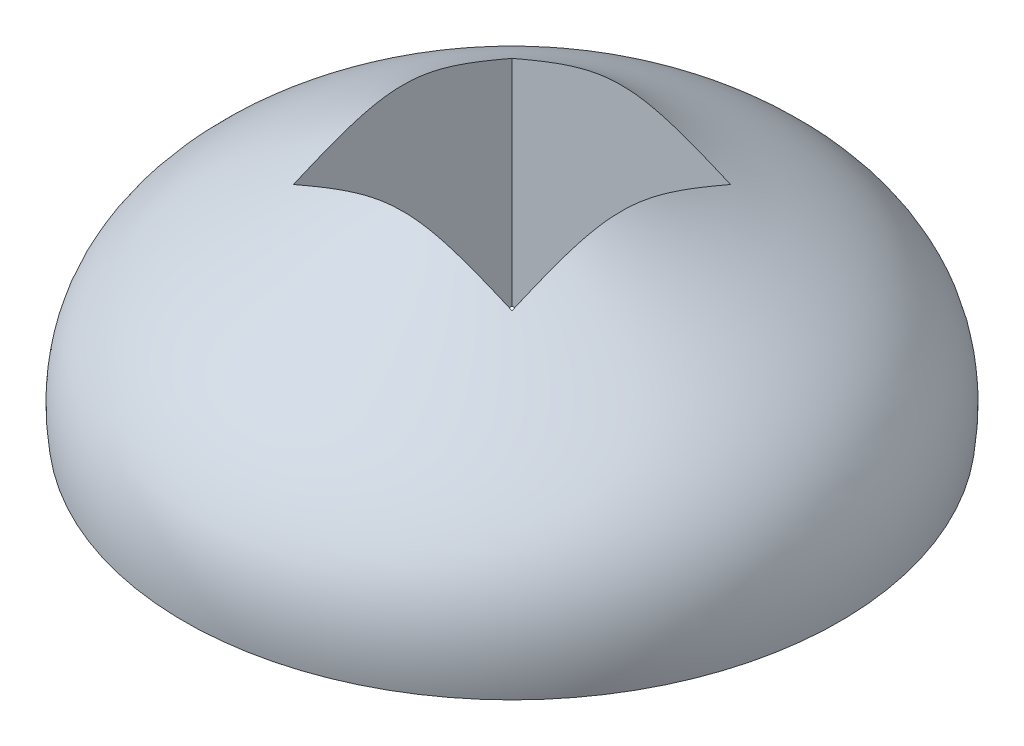
ISO-10303-21;
HEADER;
FILE_DESCRIPTION(('STEP AP214'),'2;1');
FILE_NAME('part.step','',(''),(''),'','','');
FILE_SCHEMA(('AUTOMOTIVE_DESIGN { 1 0 10303 214 1 1 1 1 }'));
ENDSEC;
DATA;
#1=APPLICATION_CONTEXT('core data for automotive mechanical design processes');
#2=APPLICATION_PROTOCOL_DEFINITION('international standard','automotive_design',2000,#1);
#3=PRODUCT_CONTEXT('',#1,'mechanical');
#4=PRODUCT('Part','Part','',(#3));
#5=PRODUCT_RELATED_PRODUCT_CATEGORY('part','',(#4));
#6=PRODUCT_DEFINITION_FORMATION('','',#4);
#7=PRODUCT_DEFINITION_CONTEXT('part definition',#1,'design');
#8=PRODUCT_DEFINITION('design','',#6,#7);
#9=PRODUCT_DEFINITION_SHAPE('','',#8);
#10=(LENGTH_UNIT() NAMED_UNIT(*) SI_UNIT(.MILLI.,.METRE.));
#11=(NAMED_UNIT(*) PLANE_ANGLE_UNIT() SI_UNIT($,.RADIAN.));
#12=(NAMED_UNIT(*) SI_UNIT($,.STERADIAN.) SOLID_ANGLE_UNIT());
#13=UNCERTAINTY_MEASURE_WITH_UNIT(LENGTH_MEASURE(1.E-05),#10,'distance_accuracy_value','');
#14=(GEOMETRIC_REPRESENTATION_CONTEXT(3) GLOBAL_UNCERTAINTY_ASSIGNED_CONTEXT((#13)) GLOBAL_UNIT_ASSIGNED_CONTEXT((#10,
#11,#12)) REPRESENTATION_CONTEXT('',''));
#15=CARTESIAN_POINT('',(0.,0.,0.));
#16=DIRECTION('',(0.,0.,1.));
#17=DIRECTION('',(1.,0.,0.));
#18=AXIS2_PLACEMENT_3D('',#15,#16,#17);
#19=CARTESIAN_POINT('',(0.,0.,0.));
#20=DIRECTION('',(0.,-1.,0.));
#21=DIRECTION('',(0.,0.,-1.));
#22=AXIS2_PLACEMENT_3D('',#19,#20,#21);
#23=PLANE('',#22);
#24=DIRECTION('',(0.,0.,1.));
#25=VECTOR('',#24,1.);
#26=CARTESIAN_POINT('',(0.2,0.,-0.2));
#27=LINE('',#26,#25);
#28=CARTESIAN_POINT('',(0.2,0.,-0.2));
#29=VERTEX_POINT('',#28);
#30=CARTESIAN_POINT('',(0.2,0.,0.2));
#31=VERTEX_POINT('',#30);
#32=EDGE_CURVE('E52',#29,#31,#27,.T.);
#33=ORIENTED_EDGE('',*,*,#32,.F.);
#34=DIRECTION('',(1.,0.,0.));
#35=VECTOR('',#34,1.);
#36=CARTESIAN_POINT('',(-0.2,0.,-0.2));
#37=LINE('',#36,#35);
#38=CARTESIAN_POINT('',(-0.2,0.,-0.2));
#39=VERTEX_POINT('',#38);
#40=EDGE_CURVE('E95',#39,#29,#37,.T.);
#41=ORIENTED_EDGE('',*,*,#40,.F.);
#42=DIRECTION('',(0.,0.,-1.));
#43=VECTOR('',#42,1.);
#44=CARTESIAN_POINT('',(-0.2,0.,-0.2));
#45=LINE('',#44,#43);
#46=CARTESIAN_POINT('',(-0.2,0.,0.2));
#47=VERTEX_POINT('',#46);
#48=EDGE_CURVE('E80',#47,#39,#45,.T.);
#49=ORIENTED_EDGE('',*,*,#48,.F.);
#50=DIRECTION('',(-1.,0.,0.));
#51=VECTOR('',#50,1.);
#52=CARTESIAN_POINT('',(-0.2,0.,0.2));
#53=LINE('',#52,#51);
#54=EDGE_CURVE('E89',#31,#47,#53,.T.);
#55=ORIENTED_EDGE('',*,*,#54,.F.);
#56=EDGE_LOOP('',(#33,#41,#49,#55));
#57=FACE_BOUND('',#56,.T.);
#58=CARTESIAN_POINT('',(0.,0.,0.));
#59=DIRECTION('',(0.,-1.,0.));
#60=DIRECTION('',(0.,0.,-1.));
#61=AXIS2_PLACEMENT_3D('',#58,#59,#60);
#62=CIRCLE('',#61,0.6);
#63=CARTESIAN_POINT('',(0.,0.,-0.6));
#64=VERTEX_POINT('',#63);
#65=EDGE_CURVE('E102',#64,#64,#62,.T.);
#66=ORIENTED_EDGE('',*,*,#65,.T.);
#67=EDGE_LOOP('',(#66));
#68=FACE_BOUND('',#67,.T.);
#69=ADVANCED_FACE('F33',(#57,#68),#23,.T.);
#70=CARTESIAN_POINT('',(0.6,0.,0.));
#71=CARTESIAN_POINT('',(0.641051819996733,0.302201542156068,0.));
#72=CARTESIAN_POINT('',(0.294253127996891,0.32466999156842,0.));
#73=CARTESIAN_POINT('',(0.15,0.5,0.));
#74=B_SPLINE_CURVE_WITH_KNOTS('',3,(#70,#71,#72,#73),.UNSPECIFIED.,.F.,.F.,(4,4),(0.,1.),.UNSPECIFIED.);
#75=CARTESIAN_POINT('',(0.,0.,0.));
#76=DIRECTION('',(0.,-1.,0.));
#77=AXIS1_PLACEMENT('',#75,#76);
#78=SURFACE_OF_REVOLUTION('',#74,#77);
#79=CARTESIAN_POINT('',(0.2,0.392889667395908,0.2));
#80=CARTESIAN_POINT('',(0.2,0.397626201314701,0.188951413835387));
#81=CARTESIAN_POINT('',(0.2,0.402327383256414,0.177885116854765));
#82=CARTESIAN_POINT('',(0.2,0.411518214020456,0.155620924782071));
#83=CARTESIAN_POINT('',(0.2,0.416007076777544,0.144422707320643));
#84=CARTESIAN_POINT('',(0.2,0.424606017642498,0.121851798446511));
#85=CARTESIAN_POINT('',(0.2,0.428715333823758,0.110478807338444));
#86=CARTESIAN_POINT('',(0.2,0.43622636545588,0.0875146454357258));
#87=CARTESIAN_POINT('',(0.2,0.439628941956757,0.0759237591208809));
#88=CARTESIAN_POINT('',(0.2,0.44621715042275,0.0483554901760638));
#89=CARTESIAN_POINT('',(0.2,0.448921807868027,0.0322459738117186));
#90=CARTESIAN_POINT('',(0.2,0.450532271607376,0.00793471426890487));
#91=CARTESIAN_POINT('',(0.2,0.450662127453317,-0.000187608319448706));
#92=CARTESIAN_POINT('',(0.2,0.45010522282215,-0.0164013095280964));
#93=CARTESIAN_POINT('',(0.2,0.4494186711464,-0.02449269552974));
#94=CARTESIAN_POINT('',(0.2,0.447105048909684,-0.042166192704818));
#95=CARTESIAN_POINT('',(0.2,0.445318904222008,-0.0517268487581755));
#96=CARTESIAN_POINT('',(0.2,0.440951156575042,-0.0706819362467757));
#97=CARTESIAN_POINT('',(0.2,0.438367519550667,-0.0800758769171883));
#98=CARTESIAN_POINT('',(0.2,0.432654104744141,-0.0987288838906953));
#99=CARTESIAN_POINT('',(0.200000000000001,0.429522387531808,-0.107987340285656));
#100=CARTESIAN_POINT('',(0.199999999999999,0.422843401105243,-0.126581040370459));
#101=CARTESIAN_POINT('',(0.199999999999998,0.419288508509879,-0.135913495870978));
#102=CARTESIAN_POINT('',(0.200000000000002,0.411978910085021,-0.154452323786969));
#103=CARTESIAN_POINT('',(0.200000000000007,0.408225130705793,-0.163659066105171));
#104=CARTESIAN_POINT('',(0.199999999999993,0.400620345628115,-0.181915049086706));
#105=CARTESIAN_POINT('',(0.199999999999972,0.396770842555103,-0.190964913417239));
#106=CARTESIAN_POINT('',(0.199999999999924,0.39288966739595,-0.19999999999998));
#107=B_SPLINE_CURVE_WITH_KNOTS('',3,(#79,#80,#81,#82,#83,#84,#85,#86,#87,#88,#89,#90,#91,#92,
#93,#94,#95,#96,#97,#98,#99,#100,#101,#102,#103,#104,#105,#106),.UNSPECIFIED.,.F.,.F.,(4,2,2,2,
2,2,2,2,2,2,2,2,2,4),(0.,0.036066514702991,0.0722575062100786,0.10851963878371,
0.144737329155938,0.193466169220277,0.217795418667022,0.242118447093291,0.271248960946149,
0.300454397075977,0.329765349668377,0.359720825430923,0.389547294590759,0.41904917646508),.UNSPECIFIED.);
#108=CARTESIAN_POINT('',(0.2,0.39288966739595,0.2));
#109=VERTEX_POINT('',#108);
#110=CARTESIAN_POINT('',(0.2,0.392889667395909,-0.2));
#111=VERTEX_POINT('',#110);
#112=EDGE_CURVE('E11',#109,#111,#107,.T.);
#113=ORIENTED_EDGE('',*,*,#112,.F.);
#114=CARTESIAN_POINT('',(-0.2,0.392889667395908,0.2));
#115=CARTESIAN_POINT('',(-0.188951413835387,0.397626201314701,0.2));
#116=CARTESIAN_POINT('',(-0.177885116854765,0.402327383256414,0.2));
#117=CARTESIAN_POINT('',(-0.155620924782071,0.411518214020456,0.2));
#118=CARTESIAN_POINT('',(-0.144422707320643,0.416007076777544,0.2));
#119=CARTESIAN_POINT('',(-0.121851798446511,0.424606017642497,0.2));
#120=CARTESIAN_POINT('',(-0.110478807338444,0.428715333823758,0.2));
#121=CARTESIAN_POINT('',(-0.0875146454357259,0.43622636545588,0.2));
#122=CARTESIAN_POINT('',(-0.075923759120881,0.439628941956757,0.2));
#123=CARTESIAN_POINT('',(-0.0483554901760639,0.446217150422749,0.2));
#124=CARTESIAN_POINT('',(-0.0322459738117187,0.448921807868027,0.2));
#125=CARTESIAN_POINT('',(-0.00793471426890493,0.450532271607376,0.2));
#126=CARTESIAN_POINT('',(0.00018760831944863,0.450662127453317,0.2));
#127=CARTESIAN_POINT('',(0.0164013095280963,0.45010522282215,0.2));
#128=CARTESIAN_POINT('',(0.0244926955297399,0.4494186711464,0.2));
#129=CARTESIAN_POINT('',(0.0421661927048179,0.447105048909684,0.2));
#130=CARTESIAN_POINT('',(0.0517268487581753,0.445318904222008,0.2));
#131=CARTESIAN_POINT('',(0.0706819362467755,0.440951156575042,0.2));
#132=CARTESIAN_POINT('',(0.0800758769171882,0.438367519550667,0.2));
#133=CARTESIAN_POINT('',(0.0987288838906951,0.432654104744141,0.2));
#134=CARTESIAN_POINT('',(0.107987340285656,0.429522387531808,0.200000000000001));
#135=CARTESIAN_POINT('',(0.126581040370459,0.422843401105243,0.199999999999999));
#136=CARTESIAN_POINT('',(0.135913495870978,0.419288508509879,0.199999999999998));
#137=CARTESIAN_POINT('',(0.154452323786969,0.411978910085021,0.200000000000002));
#138=CARTESIAN_POINT('',(0.163659066105171,0.408225130705793,0.200000000000008));
#139=CARTESIAN_POINT('',(0.181915049086706,0.400620345628115,0.199999999999993));
#140=CARTESIAN_POINT('',(0.190964913417239,0.396770842555103,0.199999999999972));
#141=CARTESIAN_POINT('',(0.19999999999998,0.39288966739595,0.199999999999924));
#142=B_SPLINE_CURVE_WITH_KNOTS('',3,(#114,#115,#116,#117,#118,#119,#120,#121,#122,#123,#124,
#125,#126,#127,#128,#129,#130,#131,#132,#133,#134,#135,#136,#137,#138,#139,#140,#141),
.UNSPECIFIED.,.F.,.F.,(4,2,2,2,2,2,2,2,2,2,2,2,2,4),(0.,0.036066514702991,0.0722575062100785,
0.10851963878371,0.144737329155938,0.193466169220276,0.217795418667022,0.242118447093291,
0.271248960946148,0.300454397075977,0.329765349668377,0.359720825430922,0.389547294590759,
0.41904917646508),.UNSPECIFIED.);
#143=CARTESIAN_POINT('',(-0.2,0.392889667395908,0.2));
#144=VERTEX_POINT('',#143);
#145=EDGE_CURVE('E122',#144,#109,#142,.T.);
#146=ORIENTED_EDGE('',*,*,#145,.F.);
#147=CARTESIAN_POINT('',(-0.2,0.392889667395908,-0.2));
#148=CARTESIAN_POINT('',(-0.2,0.397626201314701,-0.188951413835387));
#149=CARTESIAN_POINT('',(-0.2,0.402327383256414,-0.177885116854765));
#150=CARTESIAN_POINT('',(-0.2,0.411518214020456,-0.155620924782071));
#151=CARTESIAN_POINT('',(-0.2,0.416007076777544,-0.144422707320643));
#152=CARTESIAN_POINT('',(-0.2,0.424606017642498,-0.121851798446511));
#153=CARTESIAN_POINT('',(-0.2,0.428715333823758,-0.110478807338444));
#154=CARTESIAN_POINT('',(-0.2,0.43622636545588,-0.0875146454357257));
#155=CARTESIAN_POINT('',(-0.2,0.439628941956757,-0.0759237591208809));
#156=CARTESIAN_POINT('',(-0.2,0.44621715042275,-0.0483554901760637));
#157=CARTESIAN_POINT('',(-0.2,0.448921807868027,-0.0322459738117185));
#158=CARTESIAN_POINT('',(-0.2,0.450532271607376,-0.00793471426890475));
#159=CARTESIAN_POINT('',(-0.2,0.450662127453317,0.00018760831944881));
#160=CARTESIAN_POINT('',(-0.2,0.45010522282215,0.0164013095280965));
#161=CARTESIAN_POINT('',(-0.2,0.4494186711464,0.0244926955297401));
#162=CARTESIAN_POINT('',(-0.2,0.447105048909684,0.0421661927048181));
#163=CARTESIAN_POINT('',(-0.2,0.445318904222008,0.0517268487581755));
#164=CARTESIAN_POINT('',(-0.2,0.440951156575042,0.0706819362467757));
#165=CARTESIAN_POINT('',(-0.2,0.438367519550667,0.0800758769171883));
#166=CARTESIAN_POINT('',(-0.2,0.432654104744141,0.0987288838906952));
#167=CARTESIAN_POINT('',(-0.200000000000001,0.429522387531808,0.107987340285656));
#168=CARTESIAN_POINT('',(-0.199999999999999,0.422843401105243,0.126581040370459));
#169=CARTESIAN_POINT('',(-0.199999999999998,0.419288508509879,0.135913495870978));
#170=CARTESIAN_POINT('',(-0.200000000000002,0.411978910085021,0.154452323786969));
#171=CARTESIAN_POINT('',(-0.200000000000008,0.408225130705793,0.163659066105171));
#172=CARTESIAN_POINT('',(-0.199999999999993,0.400620345628115,0.181915049086706));
#173=CARTESIAN_POINT('',(-0.199999999999973,0.396770842555103,0.190964913417239));
#174=CARTESIAN_POINT('',(-0.199999999999924,0.39288966739595,0.19999999999998));
#175=B_SPLINE_CURVE_WITH_KNOTS('',3,(#147,#148,#149,#150,#151,#152,#153,#154,#155,#156,#157,
#158,#159,#160,#161,#162,#163,#164,#165,#166,#167,#168,#169,#170,#171,#172,#173,#174),
.UNSPECIFIED.,.F.,.F.,(4,2,2,2,2,2,2,2,2,2,2,2,2,4),(0.,0.036066514702991,0.0722575062100786,
0.10851963878371,0.144737329155938,0.193466169220277,0.217795418667022,0.242118447093291,
0.271248960946149,0.300454397075977,0.329765349668377,0.359720825430923,0.389547294590759,
0.41904917646508),.UNSPECIFIED.);
#176=CARTESIAN_POINT('',(-0.2,0.392889667395908,-0.2));
#177=VERTEX_POINT('',#176);
#178=EDGE_CURVE('E83',#177,#144,#175,.T.);
#179=ORIENTED_EDGE('',*,*,#178,.F.);
#180=CARTESIAN_POINT('',(0.2,0.392889667395909,-0.2));
#181=CARTESIAN_POINT('',(0.188951413835387,0.397626201314701,-0.2));
#182=CARTESIAN_POINT('',(0.177885116854765,0.402327383256415,-0.2));
#183=CARTESIAN_POINT('',(0.155620924782071,0.411518214020456,-0.2));
#184=CARTESIAN_POINT('',(0.144422707320643,0.416007076777544,-0.2));
#185=CARTESIAN_POINT('',(0.121851798446511,0.424606017642498,-0.2));
#186=CARTESIAN_POINT('',(0.110478807338444,0.428715333823758,-0.2));
#187=CARTESIAN_POINT('',(0.0875146454357258,0.43622636545588,-0.2));
#188=CARTESIAN_POINT('',(0.0759237591208809,0.439628941956757,-0.2));
#189=CARTESIAN_POINT('',(0.0483554901760638,0.44621715042275,-0.2));
#190=CARTESIAN_POINT('',(0.0322459738117186,0.448921807868027,-0.2));
#191=CARTESIAN_POINT('',(0.00793471426890483,0.450532271607376,-0.2));
#192=CARTESIAN_POINT('',(-0.000187608319448725,0.450662127453317,-0.2));
#193=CARTESIAN_POINT('',(-0.0164013095280964,0.45010522282215,-0.2));
#194=CARTESIAN_POINT('',(-0.02449269552974,0.4494186711464,-0.2));
#195=CARTESIAN_POINT('',(-0.042166192704818,0.447105048909684,-0.2));
#196=CARTESIAN_POINT('',(-0.0517268487581754,0.445318904222008,-0.2));
#197=CARTESIAN_POINT('',(-0.0706819362467756,0.440951156575042,-0.2));
#198=CARTESIAN_POINT('',(-0.0800758769171882,0.438367519550667,-0.2));
#199=CARTESIAN_POINT('',(-0.0987288838906952,0.432654104744141,-0.2));
#200=CARTESIAN_POINT('',(-0.107987340285656,0.429522387531808,-0.200000000000001));
#201=CARTESIAN_POINT('',(-0.126581040370459,0.422843401105243,-0.199999999999999));
#202=CARTESIAN_POINT('',(-0.135913495870978,0.419288508509879,-0.199999999999998));
#203=CARTESIAN_POINT('',(-0.154452323786969,0.411978910085021,-0.200000000000002));
#204=CARTESIAN_POINT('',(-0.163659066105171,0.408225130705793,-0.200000000000007));
#205=CARTESIAN_POINT('',(-0.181915049086706,0.400620345628115,-0.199999999999993));
#206=CARTESIAN_POINT('',(-0.190964913417239,0.396770842555103,-0.199999999999972));
#207=CARTESIAN_POINT('',(-0.19999999999998,0.39288966739595,-0.199999999999924));
#208=B_SPLINE_CURVE_WITH_KNOTS('',3,(#180,#181,#182,#183,#184,#185,#186,#187,#188,#189,#190,
#191,#192,#193,#194,#195,#196,#197,#198,#199,#200,#201,#202,#203,#204,#205,#206,#207),
.UNSPECIFIED.,.F.,.F.,(4,2,2,2,2,2,2,2,2,2,2,2,2,4),(0.,0.036066514702991,0.0722575062100785,
0.10851963878371,0.144737329155938,0.193466169220276,0.217795418667022,0.242118447093291,
0.271248960946148,0.300454397075977,0.329765349668377,0.359720825430922,0.389547294590759,
0.41904917646508),.UNSPECIFIED.);
#209=EDGE_CURVE('E45',#111,#177,#208,.T.);
#210=ORIENTED_EDGE('',*,*,#209,.F.);
#211=EDGE_LOOP('',(#113,#146,#179,#210));
#212=FACE_BOUND('',#211,.T.);
#213=ORIENTED_EDGE('',*,*,#65,.F.);
#214=EDGE_LOOP('',(#213));
#215=FACE_BOUND('',#214,.T.);
#216=ADVANCED_FACE('F113',(#212,#215),#78,.F.);
#217=CARTESIAN_POINT('',(0.2,0.5,-0.2));
#218=DIRECTION('',(1.,0.,0.));
#219=DIRECTION('',(0.,0.,-1.));
#220=AXIS2_PLACEMENT_3D('',#217,#218,#219);
#221=PLANE('',#220);
#222=ORIENTED_EDGE('',*,*,#112,.T.);
#223=DIRECTION('',(0.,-1.,0.));
#224=VECTOR('',#223,1.);
#225=CARTESIAN_POINT('',(0.2,0.5,-0.2));
#226=LINE('',#225,#224);
#227=EDGE_CURVE('E100',#111,#29,#226,.T.);
#228=ORIENTED_EDGE('',*,*,#227,.T.);
#229=ORIENTED_EDGE('',*,*,#32,.T.);
#230=DIRECTION('',(0.,-1.,0.));
#231=VECTOR('',#230,1.);
#232=CARTESIAN_POINT('',(0.2,0.5,0.2));
#233=LINE('',#232,#231);
#234=EDGE_CURVE('E86',#109,#31,#233,.T.);
#235=ORIENTED_EDGE('',*,*,#234,.F.);
#236=EDGE_LOOP('',(#222,#228,#229,#235));
#237=FACE_BOUND('',#236,.T.);
#238=ADVANCED_FACE('F116',(#237),#221,.F.);
#239=CARTESIAN_POINT('',(-0.2,0.5,-0.2));
#240=DIRECTION('',(0.,0.,-1.));
#241=DIRECTION('',(-1.,0.,0.));
#242=AXIS2_PLACEMENT_3D('',#239,#240,#241);
#243=PLANE('',#242);
#244=ORIENTED_EDGE('',*,*,#209,.T.);
#245=DIRECTION('',(0.,-1.,0.));
#246=VECTOR('',#245,1.);
#247=CARTESIAN_POINT('',(-0.2,0.5,-0.2));
#248=LINE('',#247,#246);
#249=EDGE_CURVE('E85',#177,#39,#248,.T.);
#250=ORIENTED_EDGE('',*,*,#249,.T.);
#251=ORIENTED_EDGE('',*,*,#40,.T.);
#252=ORIENTED_EDGE('',*,*,#227,.F.);
#253=EDGE_LOOP('',(#244,#250,#251,#252));
#254=FACE_BOUND('',#253,.T.);
#255=ADVANCED_FACE('F139',(#254),#243,.F.);
#256=CARTESIAN_POINT('',(-0.2,0.5,-0.2));
#257=DIRECTION('',(-1.,0.,0.));
#258=DIRECTION('',(0.,0.,1.));
#259=AXIS2_PLACEMENT_3D('',#256,#257,#258);
#260=PLANE('',#259);
#261=ORIENTED_EDGE('',*,*,#178,.T.);
#262=DIRECTION('',(0.,-1.,0.));
#263=VECTOR('',#262,1.);
#264=CARTESIAN_POINT('',(-0.2,0.5,0.2));
#265=LINE('',#264,#263);
#266=EDGE_CURVE('E60',#144,#47,#265,.T.);
#267=ORIENTED_EDGE('',*,*,#266,.T.);
#268=ORIENTED_EDGE('',*,*,#48,.T.);
#269=ORIENTED_EDGE('',*,*,#249,.F.);
#270=EDGE_LOOP('',(#261,#267,#268,#269));
#271=FACE_BOUND('',#270,.T.);
#272=ADVANCED_FACE('F77',(#271),#260,.F.);
#273=CARTESIAN_POINT('',(-0.2,0.5,0.2));
#274=DIRECTION('',(0.,0.,1.));
#275=DIRECTION('',(1.,0.,0.));
#276=AXIS2_PLACEMENT_3D('',#273,#274,#275);
#277=PLANE('',#276);
#278=ORIENTED_EDGE('',*,*,#145,.T.);
#279=ORIENTED_EDGE('',*,*,#234,.T.);
#280=ORIENTED_EDGE('',*,*,#54,.T.);
#281=ORIENTED_EDGE('',*,*,#266,.F.);
#282=EDGE_LOOP('',(#278,#279,#280,#281));
#283=FACE_BOUND('',#282,.T.);
#284=ADVANCED_FACE('F90',(#283),#277,.F.);
#285=CLOSED_SHELL('',(#69,#216,#238,#255,#272,#284));
#286=MANIFOLD_SOLID_BREP('B2',#285);
#287=ADVANCED_BREP_SHAPE_REPRESENTATION('',(#18,#286),#14);
#288=SHAPE_DEFINITION_REPRESENTATION(#9,#287);
ENDSEC;
END-ISO-10303-21;
